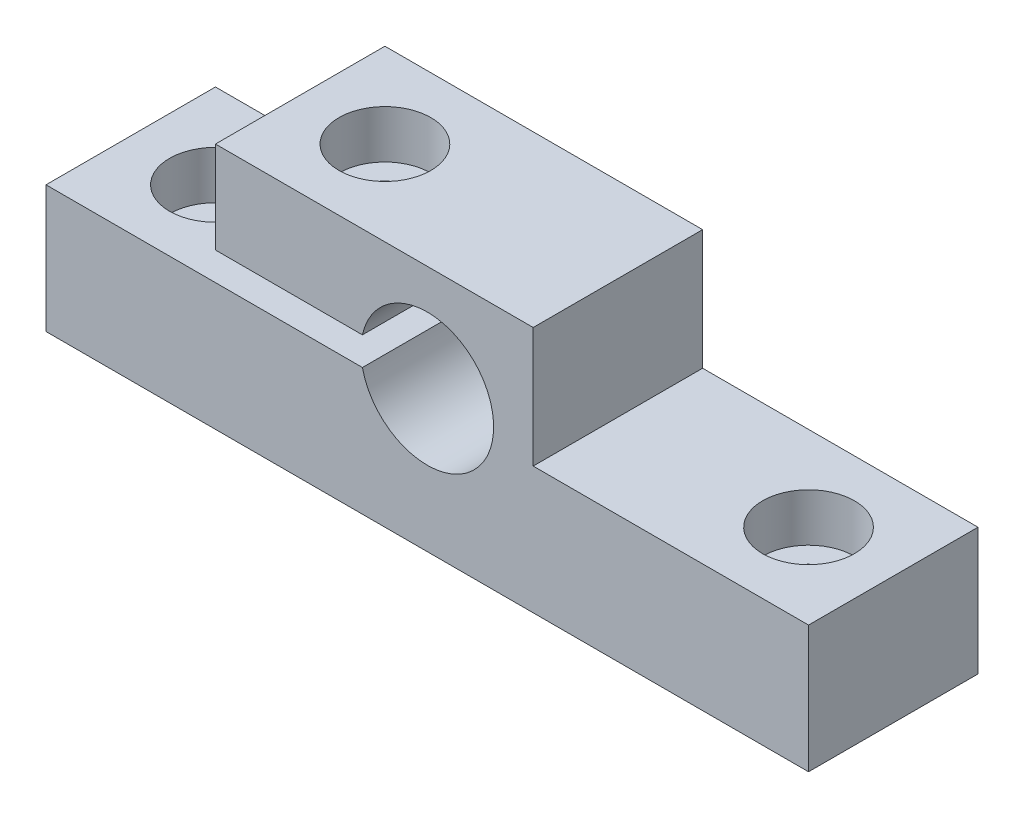
ISO-10303-21;
HEADER;
FILE_DESCRIPTION(('STEP AP214'),'2;1');
FILE_NAME('part.step','',(''),(''),'','','');
FILE_SCHEMA(('AUTOMOTIVE_DESIGN { 1 0 10303 214 1 1 1 1 }'));
ENDSEC;
DATA;
#1=APPLICATION_CONTEXT('core data for automotive mechanical design processes');
#2=APPLICATION_PROTOCOL_DEFINITION('international standard','automotive_design',2000,#1);
#3=PRODUCT_CONTEXT('',#1,'mechanical');
#4=PRODUCT('Part','Part','',(#3));
#5=PRODUCT_RELATED_PRODUCT_CATEGORY('part','',(#4));
#6=PRODUCT_DEFINITION_FORMATION('','',#4);
#7=PRODUCT_DEFINITION_CONTEXT('part definition',#1,'design');
#8=PRODUCT_DEFINITION('design','',#6,#7);
#9=PRODUCT_DEFINITION_SHAPE('','',#8);
#10=(LENGTH_UNIT() NAMED_UNIT(*) SI_UNIT(.MILLI.,.METRE.));
#11=(NAMED_UNIT(*) PLANE_ANGLE_UNIT() SI_UNIT($,.RADIAN.));
#12=(NAMED_UNIT(*) SI_UNIT($,.STERADIAN.) SOLID_ANGLE_UNIT());
#13=UNCERTAINTY_MEASURE_WITH_UNIT(LENGTH_MEASURE(1.E-05),#10,'distance_accuracy_value','');
#14=(GEOMETRIC_REPRESENTATION_CONTEXT(3) GLOBAL_UNCERTAINTY_ASSIGNED_CONTEXT((#13)) GLOBAL_UNIT_ASSIGNED_CONTEXT((#10,
#11,#12)) REPRESENTATION_CONTEXT('',''));
#15=CARTESIAN_POINT('',(0.,0.,0.));
#16=DIRECTION('',(0.,0.,1.));
#17=DIRECTION('',(1.,0.,0.));
#18=AXIS2_PLACEMENT_3D('',#15,#16,#17);
#19=CARTESIAN_POINT('',(22.9980473516045,9.,12.));
#20=DIRECTION('',(0.,-1.,0.));
#21=DIRECTION('',(1.,0.,0.));
#22=AXIS2_PLACEMENT_3D('',#19,#20,#21);
#23=PLANE('',#22);
#24=DIRECTION('',(-1.,0.,0.));
#25=VECTOR('',#24,1.);
#26=CARTESIAN_POINT('',(22.9980473516045,9.,12.));
#27=LINE('',#26,#25);
#28=CARTESIAN_POINT('',(22.407614998718,9.,12.));
#29=VERTEX_POINT('',#28);
#30=CARTESIAN_POINT('',(0.,9.,12.));
#31=VERTEX_POINT('',#30);
#32=EDGE_CURVE('E70',#29,#31,#27,.T.);
#33=ORIENTED_EDGE('',*,*,#32,.F.);
#34=DIRECTION('',(0.,0.,1.));
#35=VECTOR('',#34,1.);
#36=CARTESIAN_POINT('',(22.407614998718,9.,3.5));
#37=LINE('',#36,#35);
#38=CARTESIAN_POINT('',(22.407614998718,9.,3.5));
#39=VERTEX_POINT('',#38);
#40=EDGE_CURVE('E59',#29,#39,#37,.F.);
#41=ORIENTED_EDGE('',*,*,#40,.T.);
#42=DIRECTION('',(-1.,0.,0.));
#43=VECTOR('',#42,1.);
#44=CARTESIAN_POINT('',(22.9980473516045,9.,3.5));
#45=LINE('',#44,#43);
#46=CARTESIAN_POINT('',(22.9980473516045,9.,3.5));
#47=VERTEX_POINT('',#46);
#48=EDGE_CURVE('E11',#47,#39,#45,.T.);
#49=ORIENTED_EDGE('',*,*,#48,.F.);
#50=DIRECTION('',(0.,0.,-1.));
#51=VECTOR('',#50,1.);
#52=CARTESIAN_POINT('',(22.9980473516045,9.,12.));
#53=LINE('',#52,#51);
#54=CARTESIAN_POINT('',(22.9980473516045,9.,0.));
#55=VERTEX_POINT('',#54);
#56=EDGE_CURVE('E219',#47,#55,#53,.T.);
#57=ORIENTED_EDGE('',*,*,#56,.T.);
#58=DIRECTION('',(-1.,0.,0.));
#59=VECTOR('',#58,1.);
#60=CARTESIAN_POINT('',(22.9980473516045,9.,0.));
#61=LINE('',#60,#59);
#62=CARTESIAN_POINT('',(0.,9.,0.));
#63=VERTEX_POINT('',#62);
#64=EDGE_CURVE('E119',#55,#63,#61,.T.);
#65=ORIENTED_EDGE('',*,*,#64,.T.);
#66=DIRECTION('',(0.,0.,-1.));
#67=VECTOR('',#66,1.);
#68=CARTESIAN_POINT('',(0.,9.,12.));
#69=LINE('',#68,#67);
#70=EDGE_CURVE('E183',#31,#63,#69,.T.);
#71=ORIENTED_EDGE('',*,*,#70,.F.);
#72=EDGE_LOOP('',(#33,#41,#49,#57,#65,#71));
#73=FACE_BOUND('',#72,.T.);
#74=CARTESIAN_POINT('',(6.,9.,6.));
#75=DIRECTION('',(0.,1.,0.));
#76=DIRECTION('',(0.,0.,1.));
#77=AXIS2_PLACEMENT_3D('',#74,#75,#76);
#78=CIRCLE('',#77,3.25);
#79=CARTESIAN_POINT('',(6.,9.,9.25));
#80=VERTEX_POINT('',#79);
#81=EDGE_CURVE('E307',#80,#80,#78,.T.);
#82=ORIENTED_EDGE('',*,*,#81,.F.);
#83=EDGE_LOOP('',(#82));
#84=FACE_BOUND('',#83,.T.);
#85=ADVANCED_FACE('F41',(#73,#84),#23,.F.);
#86=CARTESIAN_POINT('',(27.,10.,12.));
#87=DIRECTION('',(0.,0.,-1.));
#88=DIRECTION('',(-1.,0.,0.));
#89=AXIS2_PLACEMENT_3D('',#86,#87,#88);
#90=CYLINDRICAL_SURFACE('',#89,4.125);
#91=CARTESIAN_POINT('',(27.,10.,3.5));
#92=DIRECTION('',(0.,0.,1.));
#93=DIRECTION('',(1.,0.,0.));
#94=AXIS2_PLACEMENT_3D('',#91,#92,#93);
#95=CIRCLE('',#94,4.125);
#96=CARTESIAN_POINT('',(22.9980473516045,11.,3.5));
#97=VERTEX_POINT('',#96);
#98=EDGE_CURVE('E261',#97,#47,#95,.F.);
#99=ORIENTED_EDGE('',*,*,#98,.F.);
#100=DIRECTION('',(0.,0.,-1.));
#101=VECTOR('',#100,1.);
#102=CARTESIAN_POINT('',(22.9980473516045,11.,12.));
#103=LINE('',#102,#101);
#104=CARTESIAN_POINT('',(22.9980473516045,11.,0.));
#105=VERTEX_POINT('',#104);
#106=EDGE_CURVE('E222',#97,#105,#103,.T.);
#107=ORIENTED_EDGE('',*,*,#106,.T.);
#108=CARTESIAN_POINT('',(27.,10.,0.));
#109=DIRECTION('',(0.,0.,-1.));
#110=DIRECTION('',(1.,0.,0.));
#111=AXIS2_PLACEMENT_3D('',#108,#109,#110);
#112=CIRCLE('',#111,4.125);
#113=EDGE_CURVE('E210',#105,#55,#112,.T.);
#114=ORIENTED_EDGE('',*,*,#113,.T.);
#115=ORIENTED_EDGE('',*,*,#56,.F.);
#116=EDGE_LOOP('',(#99,#107,#114,#115));
#117=FACE_BOUND('',#116,.T.);
#118=ADVANCED_FACE('F374',(#117),#90,.F.);
#119=CARTESIAN_POINT('',(0.,0.,12.));
#120=DIRECTION('',(1.,0.,0.));
#121=DIRECTION('',(0.,0.,-1.));
#122=AXIS2_PLACEMENT_3D('',#119,#120,#121);
#123=PLANE('',#122);
#124=DIRECTION('',(0.,-1.,0.));
#125=VECTOR('',#124,1.);
#126=CARTESIAN_POINT('',(0.,0.,0.));
#127=LINE('',#126,#125);
#128=CARTESIAN_POINT('',(0.,0.,0.));
#129=VERTEX_POINT('',#128);
#130=EDGE_CURVE('E184',#63,#129,#127,.T.);
#131=ORIENTED_EDGE('',*,*,#130,.T.);
#132=DIRECTION('',(0.,0.,-1.));
#133=VECTOR('',#132,1.);
#134=CARTESIAN_POINT('',(0.,0.,12.));
#135=LINE('',#134,#133);
#136=CARTESIAN_POINT('',(0.,0.,12.));
#137=VERTEX_POINT('',#136);
#138=EDGE_CURVE('E241',#137,#129,#135,.T.);
#139=ORIENTED_EDGE('',*,*,#138,.F.);
#140=DIRECTION('',(0.,-1.,0.));
#141=VECTOR('',#140,1.);
#142=CARTESIAN_POINT('',(0.,0.,12.));
#143=LINE('',#142,#141);
#144=EDGE_CURVE('E216',#31,#137,#143,.T.);
#145=ORIENTED_EDGE('',*,*,#144,.F.);
#146=ORIENTED_EDGE('',*,*,#70,.T.);
#147=EDGE_LOOP('',(#131,#139,#145,#146));
#148=FACE_BOUND('',#147,.T.);
#149=ADVANCED_FACE('F43',(#148),#123,.F.);
#150=CARTESIAN_POINT('',(0.,0.,12.));
#151=DIRECTION('',(0.,1.,0.));
#152=DIRECTION('',(0.,0.,1.));
#153=AXIS2_PLACEMENT_3D('',#150,#151,#152);
#154=PLANE('',#153);
#155=CARTESIAN_POINT('',(6.,0.,6.));
#156=DIRECTION('',(0.,1.,0.));
#157=DIRECTION('',(0.,0.,1.));
#158=AXIS2_PLACEMENT_3D('',#155,#156,#157);
#159=CIRCLE('',#158,1.6);
#160=CARTESIAN_POINT('',(6.,0.,7.6));
#161=VERTEX_POINT('',#160);
#162=EDGE_CURVE('E287',#161,#161,#159,.T.);
#163=ORIENTED_EDGE('',*,*,#162,.T.);
#164=EDGE_LOOP('',(#163));
#165=FACE_BOUND('',#164,.T.);
#166=CARTESIAN_POINT('',(48.,0.,6.));
#167=DIRECTION('',(0.,1.,0.));
#168=DIRECTION('',(0.,0.,1.));
#169=AXIS2_PLACEMENT_3D('',#166,#167,#168);
#170=CIRCLE('',#169,1.6);
#171=CARTESIAN_POINT('',(48.,0.,7.6));
#172=VERTEX_POINT('',#171);
#173=EDGE_CURVE('E300',#172,#172,#170,.T.);
#174=ORIENTED_EDGE('',*,*,#173,.T.);
#175=EDGE_LOOP('',(#174));
#176=FACE_BOUND('',#175,.T.);
#177=DIRECTION('',(1.,0.,0.));
#178=VECTOR('',#177,1.);
#179=CARTESIAN_POINT('',(0.,0.,0.));
#180=LINE('',#179,#178);
#181=CARTESIAN_POINT('',(54.,0.,0.));
#182=VERTEX_POINT('',#181);
#183=EDGE_CURVE('E188',#129,#182,#180,.T.);
#184=ORIENTED_EDGE('',*,*,#183,.T.);
#185=DIRECTION('',(0.,0.,-1.));
#186=VECTOR('',#185,1.);
#187=CARTESIAN_POINT('',(54.,0.,12.));
#188=LINE('',#187,#186);
#189=CARTESIAN_POINT('',(54.,0.,12.));
#190=VERTEX_POINT('',#189);
#191=EDGE_CURVE('E237',#190,#182,#188,.T.);
#192=ORIENTED_EDGE('',*,*,#191,.F.);
#193=DIRECTION('',(1.,0.,0.));
#194=VECTOR('',#193,1.);
#195=CARTESIAN_POINT('',(0.,0.,12.));
#196=LINE('',#195,#194);
#197=EDGE_CURVE('E128',#137,#190,#196,.T.);
#198=ORIENTED_EDGE('',*,*,#197,.F.);
#199=ORIENTED_EDGE('',*,*,#138,.T.);
#200=EDGE_LOOP('',(#184,#192,#198,#199));
#201=FACE_BOUND('',#200,.T.);
#202=ADVANCED_FACE('F332',(#165,#176,#201),#154,.F.);
#203=CARTESIAN_POINT('',(54.,0.,12.));
#204=DIRECTION('',(-1.,0.,0.));
#205=DIRECTION('',(0.,0.,1.));
#206=AXIS2_PLACEMENT_3D('',#203,#204,#205);
#207=PLANE('',#206);
#208=DIRECTION('',(0.,1.,0.));
#209=VECTOR('',#208,1.);
#210=CARTESIAN_POINT('',(54.,0.,0.));
#211=LINE('',#210,#209);
#212=CARTESIAN_POINT('',(54.,9.,0.));
#213=VERTEX_POINT('',#212);
#214=EDGE_CURVE('E192',#182,#213,#211,.T.);
#215=ORIENTED_EDGE('',*,*,#214,.T.);
#216=DIRECTION('',(0.,0.,-1.));
#217=VECTOR('',#216,1.);
#218=CARTESIAN_POINT('',(54.,9.,12.));
#219=LINE('',#218,#217);
#220=CARTESIAN_POINT('',(54.,9.,12.));
#221=VERTEX_POINT('',#220);
#222=EDGE_CURVE('E233',#221,#213,#219,.T.);
#223=ORIENTED_EDGE('',*,*,#222,.F.);
#224=DIRECTION('',(0.,1.,0.));
#225=VECTOR('',#224,1.);
#226=CARTESIAN_POINT('',(54.,0.,12.));
#227=LINE('',#226,#225);
#228=EDGE_CURVE('E277',#190,#221,#227,.T.);
#229=ORIENTED_EDGE('',*,*,#228,.F.);
#230=ORIENTED_EDGE('',*,*,#191,.T.);
#231=EDGE_LOOP('',(#215,#223,#229,#230));
#232=FACE_BOUND('',#231,.T.);
#233=ADVANCED_FACE('F357',(#232),#207,.F.);
#234=CARTESIAN_POINT('',(54.,9.,12.));
#235=DIRECTION('',(0.,-1.,0.));
#236=DIRECTION('',(1.,0.,0.));
#237=AXIS2_PLACEMENT_3D('',#234,#235,#236);
#238=PLANE('',#237);
#239=CARTESIAN_POINT('',(48.,9.,6.));
#240=DIRECTION('',(0.,1.,0.));
#241=DIRECTION('',(0.,0.,1.));
#242=AXIS2_PLACEMENT_3D('',#239,#240,#241);
#243=CIRCLE('',#242,3.25);
#244=CARTESIAN_POINT('',(48.,9.,9.25));
#245=VERTEX_POINT('',#244);
#246=EDGE_CURVE('E291',#245,#245,#243,.T.);
#247=ORIENTED_EDGE('',*,*,#246,.F.);
#248=EDGE_LOOP('',(#247));
#249=FACE_BOUND('',#248,.T.);
#250=DIRECTION('',(-1.,0.,0.));
#251=VECTOR('',#250,1.);
#252=CARTESIAN_POINT('',(54.,9.,0.));
#253=LINE('',#252,#251);
#254=CARTESIAN_POINT('',(34.5,9.,0.));
#255=VERTEX_POINT('',#254);
#256=EDGE_CURVE('E195',#213,#255,#253,.T.);
#257=ORIENTED_EDGE('',*,*,#256,.T.);
#258=DIRECTION('',(0.,0.,-1.));
#259=VECTOR('',#258,1.);
#260=CARTESIAN_POINT('',(34.5,9.,12.));
#261=LINE('',#260,#259);
#262=CARTESIAN_POINT('',(34.5,9.,12.));
#263=VERTEX_POINT('',#262);
#264=EDGE_CURVE('E229',#263,#255,#261,.T.);
#265=ORIENTED_EDGE('',*,*,#264,.F.);
#266=DIRECTION('',(-1.,0.,0.));
#267=VECTOR('',#266,1.);
#268=CARTESIAN_POINT('',(54.,9.,12.));
#269=LINE('',#268,#267);
#270=EDGE_CURVE('E280',#221,#263,#269,.T.);
#271=ORIENTED_EDGE('',*,*,#270,.F.);
#272=ORIENTED_EDGE('',*,*,#222,.T.);
#273=EDGE_LOOP('',(#257,#265,#271,#272));
#274=FACE_BOUND('',#273,.T.);
#275=ADVANCED_FACE('F353',(#249,#274),#238,.F.);
#276=CARTESIAN_POINT('',(34.5,17.5,12.));
#277=DIRECTION('',(-1.,0.,0.));
#278=DIRECTION('',(0.,-1.,0.));
#279=AXIS2_PLACEMENT_3D('',#276,#277,#278);
#280=PLANE('',#279);
#281=DIRECTION('',(0.,1.,0.));
#282=VECTOR('',#281,1.);
#283=CARTESIAN_POINT('',(34.5,17.5,0.));
#284=LINE('',#283,#282);
#285=CARTESIAN_POINT('',(34.5,17.5,0.));
#286=VERTEX_POINT('',#285);
#287=EDGE_CURVE('E198',#255,#286,#284,.T.);
#288=ORIENTED_EDGE('',*,*,#287,.T.);
#289=DIRECTION('',(0.,0.,-1.));
#290=VECTOR('',#289,1.);
#291=CARTESIAN_POINT('',(34.5,17.5,12.));
#292=LINE('',#291,#290);
#293=CARTESIAN_POINT('',(34.5,17.5,12.));
#294=VERTEX_POINT('',#293);
#295=EDGE_CURVE('E167',#294,#286,#292,.T.);
#296=ORIENTED_EDGE('',*,*,#295,.F.);
#297=DIRECTION('',(0.,1.,0.));
#298=VECTOR('',#297,1.);
#299=CARTESIAN_POINT('',(34.5,17.5,12.));
#300=LINE('',#299,#298);
#301=EDGE_CURVE('E153',#263,#294,#300,.T.);
#302=ORIENTED_EDGE('',*,*,#301,.F.);
#303=ORIENTED_EDGE('',*,*,#264,.T.);
#304=EDGE_LOOP('',(#288,#296,#302,#303));
#305=FACE_BOUND('',#304,.T.);
#306=ADVANCED_FACE('F356',(#305),#280,.F.);
#307=CARTESIAN_POINT('',(12.,17.5,12.));
#308=DIRECTION('',(0.,-1.,0.));
#309=DIRECTION('',(0.,0.,-1.));
#310=AXIS2_PLACEMENT_3D('',#307,#308,#309);
#311=PLANE('',#310);
#312=CARTESIAN_POINT('',(18.,17.5,6.));
#313=DIRECTION('',(0.,1.,0.));
#314=DIRECTION('',(0.,0.,1.));
#315=AXIS2_PLACEMENT_3D('',#312,#313,#314);
#316=CIRCLE('',#315,3.25);
#317=CARTESIAN_POINT('',(18.,17.5,9.25));
#318=VERTEX_POINT('',#317);
#319=EDGE_CURVE('E325',#318,#318,#316,.T.);
#320=ORIENTED_EDGE('',*,*,#319,.F.);
#321=EDGE_LOOP('',(#320));
#322=FACE_BOUND('',#321,.T.);
#323=DIRECTION('',(-1.,0.,0.));
#324=VECTOR('',#323,1.);
#325=CARTESIAN_POINT('',(12.,17.5,0.));
#326=LINE('',#325,#324);
#327=CARTESIAN_POINT('',(12.,17.5,0.));
#328=VERTEX_POINT('',#327);
#329=EDGE_CURVE('E163',#286,#328,#326,.T.);
#330=ORIENTED_EDGE('',*,*,#329,.T.);
#331=DIRECTION('',(0.,0.,-1.));
#332=VECTOR('',#331,1.);
#333=CARTESIAN_POINT('',(12.,17.5,12.));
#334=LINE('',#333,#332);
#335=CARTESIAN_POINT('',(12.,17.5,12.));
#336=VERTEX_POINT('',#335);
#337=EDGE_CURVE('E160',#336,#328,#334,.T.);
#338=ORIENTED_EDGE('',*,*,#337,.F.);
#339=DIRECTION('',(-1.,0.,0.));
#340=VECTOR('',#339,1.);
#341=CARTESIAN_POINT('',(12.,17.5,12.));
#342=LINE('',#341,#340);
#343=EDGE_CURVE('E145',#294,#336,#342,.T.);
#344=ORIENTED_EDGE('',*,*,#343,.F.);
#345=ORIENTED_EDGE('',*,*,#295,.T.);
#346=EDGE_LOOP('',(#330,#338,#344,#345));
#347=FACE_BOUND('',#346,.T.);
#348=ADVANCED_FACE('F161',(#322,#347),#311,.F.);
#349=CARTESIAN_POINT('',(12.,17.5,12.));
#350=DIRECTION('',(1.,0.,0.));
#351=DIRECTION('',(0.,0.,-1.));
#352=AXIS2_PLACEMENT_3D('',#349,#350,#351);
#353=PLANE('',#352);
#354=DIRECTION('',(0.,-1.,0.));
#355=VECTOR('',#354,1.);
#356=CARTESIAN_POINT('',(12.,17.5,0.));
#357=LINE('',#356,#355);
#358=CARTESIAN_POINT('',(12.,11.,0.));
#359=VERTEX_POINT('',#358);
#360=EDGE_CURVE('E203',#328,#359,#357,.T.);
#361=ORIENTED_EDGE('',*,*,#360,.T.);
#362=DIRECTION('',(0.,0.,-1.));
#363=VECTOR('',#362,1.);
#364=CARTESIAN_POINT('',(12.,11.,12.));
#365=LINE('',#364,#363);
#366=CARTESIAN_POINT('',(12.,11.,12.));
#367=VERTEX_POINT('',#366);
#368=EDGE_CURVE('E168',#367,#359,#365,.T.);
#369=ORIENTED_EDGE('',*,*,#368,.F.);
#370=DIRECTION('',(0.,-1.,0.));
#371=VECTOR('',#370,1.);
#372=CARTESIAN_POINT('',(12.,17.5,12.));
#373=LINE('',#372,#371);
#374=EDGE_CURVE('E150',#336,#367,#373,.T.);
#375=ORIENTED_EDGE('',*,*,#374,.F.);
#376=ORIENTED_EDGE('',*,*,#337,.T.);
#377=EDGE_LOOP('',(#361,#369,#375,#376));
#378=FACE_BOUND('',#377,.T.);
#379=ADVANCED_FACE('F170',(#378),#353,.F.);
#380=CARTESIAN_POINT('',(22.9980473516045,11.,12.));
#381=DIRECTION('',(0.,1.,0.));
#382=DIRECTION('',(-1.,0.,0.));
#383=AXIS2_PLACEMENT_3D('',#380,#381,#382);
#384=PLANE('',#383);
#385=CARTESIAN_POINT('',(18.,11.,6.));
#386=DIRECTION('',(0.,1.,0.));
#387=DIRECTION('',(-1.,0.,0.));
#388=AXIS2_PLACEMENT_3D('',#385,#386,#387);
#389=CIRCLE('',#388,1.6);
#390=CARTESIAN_POINT('',(16.4,11.,6.));
#391=VERTEX_POINT('',#390);
#392=EDGE_CURVE('E313',#391,#391,#389,.T.);
#393=ORIENTED_EDGE('',*,*,#392,.T.);
#394=EDGE_LOOP('',(#393));
#395=FACE_BOUND('',#394,.T.);
#396=DIRECTION('',(1.,0.,0.));
#397=VECTOR('',#396,1.);
#398=CARTESIAN_POINT('',(22.9980473516045,11.,3.5));
#399=LINE('',#398,#397);
#400=CARTESIAN_POINT('',(22.407614998718,11.,3.5));
#401=VERTEX_POINT('',#400);
#402=EDGE_CURVE('E189',#401,#97,#399,.T.);
#403=ORIENTED_EDGE('',*,*,#402,.F.);
#404=DIRECTION('',(0.,0.,1.));
#405=VECTOR('',#404,1.);
#406=CARTESIAN_POINT('',(22.407614998718,11.,3.5));
#407=LINE('',#406,#405);
#408=CARTESIAN_POINT('',(22.407614998718,11.,12.));
#409=VERTEX_POINT('',#408);
#410=EDGE_CURVE('E250',#401,#409,#407,.T.);
#411=ORIENTED_EDGE('',*,*,#410,.T.);
#412=DIRECTION('',(1.,0.,0.));
#413=VECTOR('',#412,1.);
#414=CARTESIAN_POINT('',(22.9980473516045,11.,12.));
#415=LINE('',#414,#413);
#416=EDGE_CURVE('E174',#367,#409,#415,.T.);
#417=ORIENTED_EDGE('',*,*,#416,.F.);
#418=ORIENTED_EDGE('',*,*,#368,.T.);
#419=DIRECTION('',(1.,0.,0.));
#420=VECTOR('',#419,1.);
#421=CARTESIAN_POINT('',(22.9980473516045,11.,0.));
#422=LINE('',#421,#420);
#423=EDGE_CURVE('E206',#359,#105,#422,.T.);
#424=ORIENTED_EDGE('',*,*,#423,.T.);
#425=ORIENTED_EDGE('',*,*,#106,.F.);
#426=EDGE_LOOP('',(#403,#411,#417,#418,#424,#425));
#427=FACE_BOUND('',#426,.T.);
#428=ADVANCED_FACE('F257',(#395,#427),#384,.F.);
#429=CARTESIAN_POINT('',(27.,10.,12.));
#430=DIRECTION('',(0.,0.,1.));
#431=DIRECTION('',(1.,0.,0.));
#432=AXIS2_PLACEMENT_3D('',#429,#430,#431);
#433=PLANE('',#432);
#434=CARTESIAN_POINT('',(27.,10.,12.));
#435=DIRECTION('',(0.,0.,1.));
#436=DIRECTION('',(1.,0.,0.));
#437=AXIS2_PLACEMENT_3D('',#434,#435,#436);
#438=CIRCLE('',#437,4.7);
#439=EDGE_CURVE('E50',#29,#409,#438,.T.);
#440=ORIENTED_EDGE('',*,*,#439,.F.);
#441=ORIENTED_EDGE('',*,*,#32,.T.);
#442=ORIENTED_EDGE('',*,*,#144,.T.);
#443=ORIENTED_EDGE('',*,*,#197,.T.);
#444=ORIENTED_EDGE('',*,*,#228,.T.);
#445=ORIENTED_EDGE('',*,*,#270,.T.);
#446=ORIENTED_EDGE('',*,*,#301,.T.);
#447=ORIENTED_EDGE('',*,*,#343,.T.);
#448=ORIENTED_EDGE('',*,*,#374,.T.);
#449=ORIENTED_EDGE('',*,*,#416,.T.);
#450=EDGE_LOOP('',(#440,#441,#442,#443,#444,#445,#446,#447,#448,#449));
#451=FACE_BOUND('',#450,.T.);
#452=ADVANCED_FACE('F147',(#451),#433,.T.);
#453=CARTESIAN_POINT('',(27.,10.,0.));
#454=DIRECTION('',(0.,0.,1.));
#455=DIRECTION('',(1.,0.,0.));
#456=AXIS2_PLACEMENT_3D('',#453,#454,#455);
#457=PLANE('',#456);
#458=ORIENTED_EDGE('',*,*,#130,.F.);
#459=ORIENTED_EDGE('',*,*,#64,.F.);
#460=ORIENTED_EDGE('',*,*,#113,.F.);
#461=ORIENTED_EDGE('',*,*,#423,.F.);
#462=ORIENTED_EDGE('',*,*,#360,.F.);
#463=ORIENTED_EDGE('',*,*,#329,.F.);
#464=ORIENTED_EDGE('',*,*,#287,.F.);
#465=ORIENTED_EDGE('',*,*,#256,.F.);
#466=ORIENTED_EDGE('',*,*,#214,.F.);
#467=ORIENTED_EDGE('',*,*,#183,.F.);
#468=EDGE_LOOP('',(#458,#459,#460,#461,#462,#463,#464,#465,#466,#467));
#469=FACE_BOUND('',#468,.T.);
#470=ADVANCED_FACE('F368',(#469),#457,.F.);
#471=CARTESIAN_POINT('',(27.,10.,3.5));
#472=DIRECTION('',(0.,0.,1.));
#473=DIRECTION('',(1.,0.,0.));
#474=AXIS2_PLACEMENT_3D('',#471,#472,#473);
#475=PLANE('',#474);
#476=ORIENTED_EDGE('',*,*,#402,.T.);
#477=ORIENTED_EDGE('',*,*,#98,.T.);
#478=ORIENTED_EDGE('',*,*,#48,.T.);
#479=CARTESIAN_POINT('',(27.,10.,3.5));
#480=DIRECTION('',(0.,0.,1.));
#481=DIRECTION('',(1.,0.,0.));
#482=AXIS2_PLACEMENT_3D('',#479,#480,#481);
#483=CIRCLE('',#482,4.7);
#484=EDGE_CURVE('E267',#39,#401,#483,.T.);
#485=ORIENTED_EDGE('',*,*,#484,.T.);
#486=EDGE_LOOP('',(#476,#477,#478,#485));
#487=FACE_BOUND('',#486,.T.);
#488=ADVANCED_FACE('F378',(#487),#475,.T.);
#489=CARTESIAN_POINT('',(27.,10.,3.5));
#490=DIRECTION('',(0.,0.,1.));
#491=DIRECTION('',(1.,0.,0.));
#492=AXIS2_PLACEMENT_3D('',#489,#490,#491);
#493=CYLINDRICAL_SURFACE('',#492,4.7);
#494=ORIENTED_EDGE('',*,*,#484,.F.);
#495=ORIENTED_EDGE('',*,*,#40,.F.);
#496=ORIENTED_EDGE('',*,*,#439,.T.);
#497=ORIENTED_EDGE('',*,*,#410,.F.);
#498=EDGE_LOOP('',(#494,#495,#496,#497));
#499=FACE_BOUND('',#498,.T.);
#500=ADVANCED_FACE('F248',(#499),#493,.F.);
#501=CARTESIAN_POINT('',(48.,9.,6.));
#502=DIRECTION('',(0.,1.,0.));
#503=DIRECTION('',(0.,0.,1.));
#504=AXIS2_PLACEMENT_3D('',#501,#502,#503);
#505=CYLINDRICAL_SURFACE('',#504,1.6);
#506=ORIENTED_EDGE('',*,*,#173,.F.);
#507=EDGE_LOOP('',(#506));
#508=FACE_BOUND('',#507,.T.);
#509=CARTESIAN_POINT('',(48.,5.6,6.));
#510=DIRECTION('',(0.,1.,0.));
#511=DIRECTION('',(0.,0.,1.));
#512=AXIS2_PLACEMENT_3D('',#509,#510,#511);
#513=CIRCLE('',#512,1.6);
#514=CARTESIAN_POINT('',(48.,5.6,7.6));
#515=VERTEX_POINT('',#514);
#516=EDGE_CURVE('E296',#515,#515,#513,.T.);
#517=ORIENTED_EDGE('',*,*,#516,.T.);
#518=EDGE_LOOP('',(#517));
#519=FACE_BOUND('',#518,.T.);
#520=ADVANCED_FACE('F334',(#508,#519),#505,.F.);
#521=CARTESIAN_POINT('',(49.6,5.6,6.));
#522=DIRECTION('',(0.,-1.,0.));
#523=DIRECTION('',(0.,0.,-1.));
#524=AXIS2_PLACEMENT_3D('',#521,#522,#523);
#525=PLANE('',#524);
#526=ORIENTED_EDGE('',*,*,#516,.F.);
#527=EDGE_LOOP('',(#526));
#528=FACE_BOUND('',#527,.T.);
#529=CARTESIAN_POINT('',(48.,5.6,6.));
#530=DIRECTION('',(0.,1.,0.));
#531=DIRECTION('',(0.,0.,1.));
#532=AXIS2_PLACEMENT_3D('',#529,#530,#531);
#533=CIRCLE('',#532,3.25);
#534=CARTESIAN_POINT('',(48.,5.6,9.25));
#535=VERTEX_POINT('',#534);
#536=EDGE_CURVE('E294',#535,#535,#533,.T.);
#537=ORIENTED_EDGE('',*,*,#536,.T.);
#538=EDGE_LOOP('',(#537));
#539=FACE_BOUND('',#538,.T.);
#540=ADVANCED_FACE('F337',(#528,#539),#525,.F.);
#541=CARTESIAN_POINT('',(48.,9.,6.));
#542=DIRECTION('',(0.,1.,0.));
#543=DIRECTION('',(0.,0.,1.));
#544=AXIS2_PLACEMENT_3D('',#541,#542,#543);
#545=CYLINDRICAL_SURFACE('',#544,3.25);
#546=ORIENTED_EDGE('',*,*,#536,.F.);
#547=EDGE_LOOP('',(#546));
#548=FACE_BOUND('',#547,.T.);
#549=ORIENTED_EDGE('',*,*,#246,.T.);
#550=EDGE_LOOP('',(#549));
#551=FACE_BOUND('',#550,.T.);
#552=ADVANCED_FACE('F343',(#548,#551),#545,.F.);
#553=CARTESIAN_POINT('',(6.,9.,6.));
#554=DIRECTION('',(0.,1.,0.));
#555=DIRECTION('',(0.,0.,1.));
#556=AXIS2_PLACEMENT_3D('',#553,#554,#555);
#557=CYLINDRICAL_SURFACE('',#556,1.6);
#558=ORIENTED_EDGE('',*,*,#162,.F.);
#559=EDGE_LOOP('',(#558));
#560=FACE_BOUND('',#559,.T.);
#561=CARTESIAN_POINT('',(6.,5.6,6.));
#562=DIRECTION('',(0.,1.,0.));
#563=DIRECTION('',(0.,0.,1.));
#564=AXIS2_PLACEMENT_3D('',#561,#562,#563);
#565=CIRCLE('',#564,1.6);
#566=CARTESIAN_POINT('',(6.,5.6,7.6));
#567=VERTEX_POINT('',#566);
#568=EDGE_CURVE('E284',#567,#567,#565,.T.);
#569=ORIENTED_EDGE('',*,*,#568,.T.);
#570=EDGE_LOOP('',(#569));
#571=FACE_BOUND('',#570,.T.);
#572=ADVANCED_FACE('F349',(#560,#571),#557,.F.);
#573=CARTESIAN_POINT('',(7.6,5.6,6.));
#574=DIRECTION('',(0.,-1.,0.));
#575=DIRECTION('',(0.,0.,-1.));
#576=AXIS2_PLACEMENT_3D('',#573,#574,#575);
#577=PLANE('',#576);
#578=ORIENTED_EDGE('',*,*,#568,.F.);
#579=EDGE_LOOP('',(#578));
#580=FACE_BOUND('',#579,.T.);
#581=CARTESIAN_POINT('',(6.,5.6,6.));
#582=DIRECTION('',(0.,1.,0.));
#583=DIRECTION('',(0.,0.,1.));
#584=AXIS2_PLACEMENT_3D('',#581,#582,#583);
#585=CIRCLE('',#584,3.25);
#586=CARTESIAN_POINT('',(6.,5.6,9.25));
#587=VERTEX_POINT('',#586);
#588=EDGE_CURVE('E288',#587,#587,#585,.T.);
#589=ORIENTED_EDGE('',*,*,#588,.T.);
#590=EDGE_LOOP('',(#589));
#591=FACE_BOUND('',#590,.T.);
#592=ADVANCED_FACE('F469',(#580,#591),#577,.F.);
#593=CARTESIAN_POINT('',(6.,9.,6.));
#594=DIRECTION('',(0.,1.,0.));
#595=DIRECTION('',(0.,0.,1.));
#596=AXIS2_PLACEMENT_3D('',#593,#594,#595);
#597=CYLINDRICAL_SURFACE('',#596,3.25);
#598=ORIENTED_EDGE('',*,*,#588,.F.);
#599=EDGE_LOOP('',(#598));
#600=FACE_BOUND('',#599,.T.);
#601=ORIENTED_EDGE('',*,*,#81,.T.);
#602=EDGE_LOOP('',(#601));
#603=FACE_BOUND('',#602,.T.);
#604=ADVANCED_FACE('F477',(#600,#603),#597,.F.);
#605=CARTESIAN_POINT('',(18.,17.5,6.));
#606=DIRECTION('',(0.,1.,0.));
#607=DIRECTION('',(0.,0.,1.));
#608=AXIS2_PLACEMENT_3D('',#605,#606,#607);
#609=CYLINDRICAL_SURFACE('',#608,1.6);
#610=ORIENTED_EDGE('',*,*,#392,.F.);
#611=EDGE_LOOP('',(#610));
#612=FACE_BOUND('',#611,.T.);
#613=CARTESIAN_POINT('',(18.,14.1,6.));
#614=DIRECTION('',(0.,1.,0.));
#615=DIRECTION('',(0.,0.,1.));
#616=AXIS2_PLACEMENT_3D('',#613,#614,#615);
#617=CIRCLE('',#616,1.6);
#618=CARTESIAN_POINT('',(18.,14.1,7.6));
#619=VERTEX_POINT('',#618);
#620=EDGE_CURVE('E316',#619,#619,#617,.T.);
#621=ORIENTED_EDGE('',*,*,#620,.T.);
#622=EDGE_LOOP('',(#621));
#623=FACE_BOUND('',#622,.T.);
#624=ADVANCED_FACE('F485',(#612,#623),#609,.F.);
#625=CARTESIAN_POINT('',(19.6,14.1,6.));
#626=DIRECTION('',(0.,-1.,0.));
#627=DIRECTION('',(0.,0.,-1.));
#628=AXIS2_PLACEMENT_3D('',#625,#626,#627);
#629=PLANE('',#628);
#630=ORIENTED_EDGE('',*,*,#620,.F.);
#631=EDGE_LOOP('',(#630));
#632=FACE_BOUND('',#631,.T.);
#633=CARTESIAN_POINT('',(18.,14.1,6.));
#634=DIRECTION('',(0.,1.,0.));
#635=DIRECTION('',(0.,0.,1.));
#636=AXIS2_PLACEMENT_3D('',#633,#634,#635);
#637=CIRCLE('',#636,3.25);
#638=CARTESIAN_POINT('',(18.,14.1,9.25));
#639=VERTEX_POINT('',#638);
#640=EDGE_CURVE('E320',#639,#639,#637,.T.);
#641=ORIENTED_EDGE('',*,*,#640,.T.);
#642=EDGE_LOOP('',(#641));
#643=FACE_BOUND('',#642,.T.);
#644=ADVANCED_FACE('F493',(#632,#643),#629,.F.);
#645=CARTESIAN_POINT('',(18.,17.5,6.));
#646=DIRECTION('',(0.,1.,0.));
#647=DIRECTION('',(0.,0.,1.));
#648=AXIS2_PLACEMENT_3D('',#645,#646,#647);
#649=CYLINDRICAL_SURFACE('',#648,3.25);
#650=ORIENTED_EDGE('',*,*,#640,.F.);
#651=EDGE_LOOP('',(#650));
#652=FACE_BOUND('',#651,.T.);
#653=ORIENTED_EDGE('',*,*,#319,.T.);
#654=EDGE_LOOP('',(#653));
#655=FACE_BOUND('',#654,.T.);
#656=ADVANCED_FACE('F501',(#652,#655),#649,.F.);
#657=CLOSED_SHELL('',(#85,#118,#149,#202,#233,#275,#306,#348,#379,#428,#452,#470,#488,#500,#520,
#540,#552,#572,#592,#604,#624,#644,#656));
#658=MANIFOLD_SOLID_BREP('B2',#657);
#659=ADVANCED_BREP_SHAPE_REPRESENTATION('',(#18,#658),#14);
#660=SHAPE_DEFINITION_REPRESENTATION(#9,#659);
ENDSEC;
END-ISO-10303-21;
